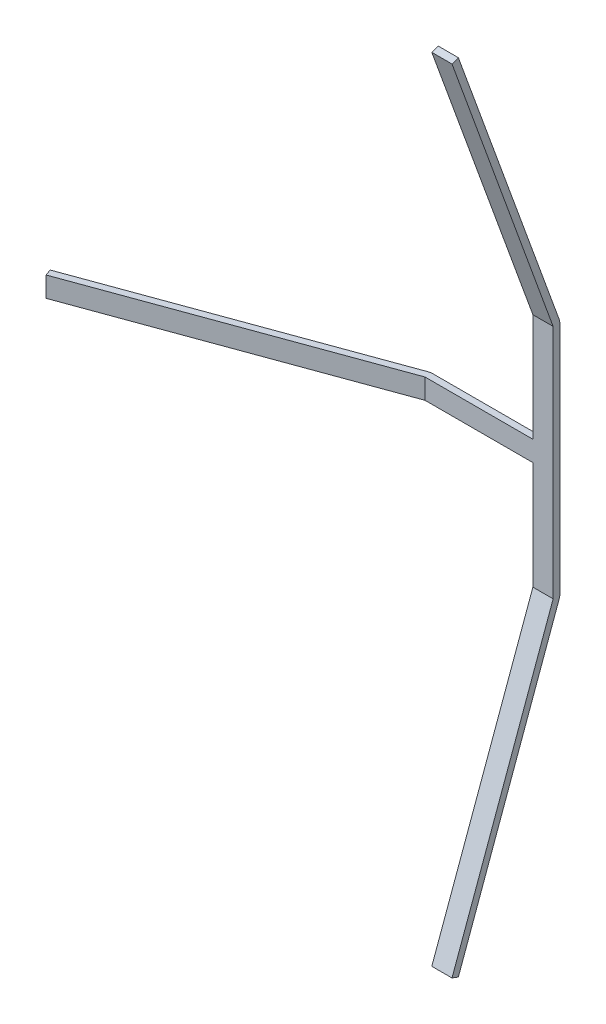
ISO-10303-21;
HEADER;
FILE_DESCRIPTION(('STEP AP214'),'2;1');
FILE_NAME('part.step','',(''),(''),'','','');
FILE_SCHEMA(('AUTOMOTIVE_DESIGN { 1 0 10303 214 1 1 1 1 }'));
ENDSEC;
DATA;
#1=APPLICATION_CONTEXT('core data for automotive mechanical design processes');
#2=APPLICATION_PROTOCOL_DEFINITION('international standard','automotive_design',2000,#1);
#3=PRODUCT_CONTEXT('',#1,'mechanical');
#4=PRODUCT('Part','Part','',(#3));
#5=PRODUCT_RELATED_PRODUCT_CATEGORY('part','',(#4));
#6=PRODUCT_DEFINITION_FORMATION('','',#4);
#7=PRODUCT_DEFINITION_CONTEXT('part definition',#1,'design');
#8=PRODUCT_DEFINITION('design','',#6,#7);
#9=PRODUCT_DEFINITION_SHAPE('','',#8);
#10=(LENGTH_UNIT() NAMED_UNIT(*) SI_UNIT(.MILLI.,.METRE.));
#11=(NAMED_UNIT(*) PLANE_ANGLE_UNIT() SI_UNIT($,.RADIAN.));
#12=(NAMED_UNIT(*) SI_UNIT($,.STERADIAN.) SOLID_ANGLE_UNIT());
#13=UNCERTAINTY_MEASURE_WITH_UNIT(LENGTH_MEASURE(1.E-05),#10,'distance_accuracy_value','');
#14=(GEOMETRIC_REPRESENTATION_CONTEXT(3) GLOBAL_UNCERTAINTY_ASSIGNED_CONTEXT((#13)) GLOBAL_UNIT_ASSIGNED_CONTEXT((#10,
#11,#12)) REPRESENTATION_CONTEXT('',''));
#15=CARTESIAN_POINT('',(0.,0.,0.));
#16=DIRECTION('',(0.,0.,1.));
#17=DIRECTION('',(1.,0.,0.));
#18=AXIS2_PLACEMENT_3D('',#15,#16,#17);
#19=CARTESIAN_POINT('',(-3.42020143325665,160.,-9.3969262078591));
#20=DIRECTION('',(0.93969262078591,0.,-0.342020143325663));
#21=DIRECTION('',(-0.342020143325663,0.,-0.93969262078591));
#22=AXIS2_PLACEMENT_3D('',#19,#20,#21);
#23=PLANE('',#22);
#24=DIRECTION('',(0.,1.,0.));
#25=VECTOR('',#24,1.);
#26=CARTESIAN_POINT('',(0.,160.,0.));
#27=LINE('',#26,#25);
#28=CARTESIAN_POINT('',(0.,160.,0.));
#29=VERTEX_POINT('',#28);
#30=CARTESIAN_POINT('',(0.,190.,0.));
#31=VERTEX_POINT('',#30);
#32=EDGE_CURVE('E102',#29,#31,#27,.T.);
#33=ORIENTED_EDGE('',*,*,#32,.T.);
#34=DIRECTION('',(0.342020143325663,0.,0.93969262078591));
#35=VECTOR('',#34,1.);
#36=CARTESIAN_POINT('',(-3.42020143325665,190.,-9.3969262078591));
#37=LINE('',#36,#35);
#38=CARTESIAN_POINT('',(-3.42020143325665,190.,-9.3969262078591));
#39=VERTEX_POINT('',#38);
#40=EDGE_CURVE('E11',#39,#31,#37,.T.);
#41=ORIENTED_EDGE('',*,*,#40,.F.);
#42=DIRECTION('',(0.,1.,0.));
#43=VECTOR('',#42,1.);
#44=CARTESIAN_POINT('',(-3.42020143325665,160.,-9.3969262078591));
#45=LINE('',#44,#43);
#46=CARTESIAN_POINT('',(-3.42020143325665,160.,-9.3969262078591));
#47=VERTEX_POINT('',#46);
#48=EDGE_CURVE('E89',#47,#39,#45,.T.);
#49=ORIENTED_EDGE('',*,*,#48,.F.);
#50=DIRECTION('',(0.342020143325663,0.,0.93969262078591));
#51=VECTOR('',#50,1.);
#52=CARTESIAN_POINT('',(-3.42020143325665,160.,-9.3969262078591));
#53=LINE('',#52,#51);
#54=EDGE_CURVE('E42',#47,#29,#53,.T.);
#55=ORIENTED_EDGE('',*,*,#54,.T.);
#56=EDGE_LOOP('',(#33,#41,#49,#55));
#57=FACE_BOUND('',#56,.T.);
#58=ADVANCED_FACE('F34',(#57),#23,.F.);
#59=CARTESIAN_POINT('',(-3.42020143325665,190.,-9.3969262078591));
#60=DIRECTION('',(0.,-1.,0.));
#61=DIRECTION('',(1.,0.,0.));
#62=AXIS2_PLACEMENT_3D('',#59,#60,#61);
#63=PLANE('',#62);
#64=DIRECTION('',(0.93969262078591,0.,-0.342020143325663));
#65=VECTOR('',#64,1.);
#66=CARTESIAN_POINT('',(0.,190.,0.));
#67=LINE('',#66,#65);
#68=CARTESIAN_POINT('',(412.121612918201,190.,-150.));
#69=VERTEX_POINT('',#68);
#70=EDGE_CURVE('E62',#31,#69,#67,.T.);
#71=ORIENTED_EDGE('',*,*,#70,.T.);
#72=DIRECTION('',(1.,0.,0.));
#73=VECTOR('',#72,1.);
#74=CARTESIAN_POINT('',(412.121612918201,190.,-150.));
#75=LINE('',#74,#73);
#76=CARTESIAN_POINT('',(572.121612918201,190.,-150.));
#77=VERTEX_POINT('',#76);
#78=EDGE_CURVE('E138',#69,#77,#75,.T.);
#79=ORIENTED_EDGE('',*,*,#78,.T.);
#80=DIRECTION('',(0.,0.,1.));
#81=VECTOR('',#80,1.);
#82=CARTESIAN_POINT('',(572.121612918201,190.,-160.));
#83=LINE('',#82,#81);
#84=CARTESIAN_POINT('',(572.121612918201,190.,-160.));
#85=VERTEX_POINT('',#84);
#86=EDGE_CURVE('E163',#85,#77,#83,.T.);
#87=ORIENTED_EDGE('',*,*,#86,.F.);
#88=DIRECTION('',(1.,0.,0.));
#89=VECTOR('',#88,1.);
#90=CARTESIAN_POINT('',(412.121612918201,190.,-160.));
#91=LINE('',#90,#89);
#92=CARTESIAN_POINT('',(412.121612918201,190.,-160.));
#93=VERTEX_POINT('',#92);
#94=EDGE_CURVE('E100',#93,#85,#91,.T.);
#95=ORIENTED_EDGE('',*,*,#94,.F.);
#96=DIRECTION('',(-0.984807753012209,0.,0.173648177666927));
#97=VECTOR('',#96,1.);
#98=CARTESIAN_POINT('',(412.121612918201,190.,-160.));
#99=LINE('',#98,#97);
#100=CARTESIAN_POINT('',(408.701411484944,190.,-159.396926207859));
#101=VERTEX_POINT('',#100);
#102=EDGE_CURVE('E95',#93,#101,#99,.T.);
#103=ORIENTED_EDGE('',*,*,#102,.T.);
#104=DIRECTION('',(0.93969262078591,0.,-0.342020143325663));
#105=VECTOR('',#104,1.);
#106=CARTESIAN_POINT('',(-3.42020143325665,190.,-9.3969262078591));
#107=LINE('',#106,#105);
#108=EDGE_CURVE('E83',#39,#101,#107,.T.);
#109=ORIENTED_EDGE('',*,*,#108,.F.);
#110=ORIENTED_EDGE('',*,*,#40,.T.);
#111=EDGE_LOOP('',(#71,#79,#87,#95,#103,#109,#110));
#112=FACE_BOUND('',#111,.T.);
#113=ADVANCED_FACE('F96',(#112),#63,.F.);
#114=CARTESIAN_POINT('',(408.701411484944,160.,-159.396926207859));
#115=DIRECTION('',(0.,1.,0.));
#116=DIRECTION('',(-1.,0.,0.));
#117=AXIS2_PLACEMENT_3D('',#114,#115,#116);
#118=PLANE('',#117);
#119=DIRECTION('',(-0.93969262078591,0.,0.342020143325663));
#120=VECTOR('',#119,1.);
#121=CARTESIAN_POINT('',(412.121612918201,160.,-150.));
#122=LINE('',#121,#120);
#123=CARTESIAN_POINT('',(412.121612918201,160.,-150.));
#124=VERTEX_POINT('',#123);
#125=EDGE_CURVE('E119',#124,#29,#122,.T.);
#126=ORIENTED_EDGE('',*,*,#125,.T.);
#127=ORIENTED_EDGE('',*,*,#54,.F.);
#128=DIRECTION('',(-0.93969262078591,0.,0.342020143325663));
#129=VECTOR('',#128,1.);
#130=CARTESIAN_POINT('',(408.701411484944,160.,-159.396926207859));
#131=LINE('',#130,#129);
#132=CARTESIAN_POINT('',(408.701411484944,160.,-159.396926207859));
#133=VERTEX_POINT('',#132);
#134=EDGE_CURVE('E50',#133,#47,#131,.T.);
#135=ORIENTED_EDGE('',*,*,#134,.F.);
#136=DIRECTION('',(0.984807753012209,0.,-0.173648177666927));
#137=VECTOR('',#136,1.);
#138=CARTESIAN_POINT('',(412.121612918201,160.,-160.));
#139=LINE('',#138,#137);
#140=CARTESIAN_POINT('',(412.121612918201,160.,-160.));
#141=VERTEX_POINT('',#140);
#142=EDGE_CURVE('E108',#133,#141,#139,.T.);
#143=ORIENTED_EDGE('',*,*,#142,.T.);
#144=DIRECTION('',(-1.,0.,0.));
#145=VECTOR('',#144,1.);
#146=CARTESIAN_POINT('',(572.121612918201,160.,-160.));
#147=LINE('',#146,#145);
#148=CARTESIAN_POINT('',(572.121612918201,160.,-160.));
#149=VERTEX_POINT('',#148);
#150=EDGE_CURVE('E72',#149,#141,#147,.T.);
#151=ORIENTED_EDGE('',*,*,#150,.F.);
#152=DIRECTION('',(0.,0.,1.));
#153=VECTOR('',#152,1.);
#154=CARTESIAN_POINT('',(572.121612918201,160.,-160.));
#155=LINE('',#154,#153);
#156=CARTESIAN_POINT('',(572.121612918201,160.,-150.));
#157=VERTEX_POINT('',#156);
#158=EDGE_CURVE('E135',#149,#157,#155,.T.);
#159=ORIENTED_EDGE('',*,*,#158,.T.);
#160=DIRECTION('',(-1.,0.,0.));
#161=VECTOR('',#160,1.);
#162=CARTESIAN_POINT('',(572.121612918201,160.,-150.));
#163=LINE('',#162,#161);
#164=EDGE_CURVE('E133',#157,#124,#163,.T.);
#165=ORIENTED_EDGE('',*,*,#164,.T.);
#166=EDGE_LOOP('',(#126,#127,#135,#143,#151,#159,#165));
#167=FACE_BOUND('',#166,.T.);
#168=ADVANCED_FACE('F130',(#167),#118,.F.);
#169=CARTESIAN_POINT('',(-3.42020143325663,0.,-9.3969262078591));
#170=DIRECTION('',(-0.342020143325663,0.,-0.93969262078591));
#171=DIRECTION('',(-0.93969262078591,0.,0.342020143325663));
#172=AXIS2_PLACEMENT_3D('',#169,#170,#171);
#173=PLANE('',#172);
#174=ORIENTED_EDGE('',*,*,#48,.T.);
#175=ORIENTED_EDGE('',*,*,#108,.T.);
#176=DIRECTION('',(0.,-1.,0.));
#177=VECTOR('',#176,1.);
#178=CARTESIAN_POINT('',(408.701411484944,160.,-159.396926207859));
#179=LINE('',#178,#177);
#180=EDGE_CURVE('E87',#101,#133,#179,.T.);
#181=ORIENTED_EDGE('',*,*,#180,.T.);
#182=ORIENTED_EDGE('',*,*,#134,.T.);
#183=EDGE_LOOP('',(#174,#175,#181,#182));
#184=FACE_BOUND('',#183,.T.);
#185=ADVANCED_FACE('F85',(#184),#173,.T.);
#186=CARTESIAN_POINT('',(0.,0.,0.));
#187=DIRECTION('',(-0.342020143325663,0.,-0.93969262078591));
#188=DIRECTION('',(-0.93969262078591,0.,0.342020143325663));
#189=AXIS2_PLACEMENT_3D('',#186,#187,#188);
#190=PLANE('',#189);
#191=ORIENTED_EDGE('',*,*,#32,.F.);
#192=ORIENTED_EDGE('',*,*,#125,.F.);
#193=DIRECTION('',(0.,-1.,0.));
#194=VECTOR('',#193,1.);
#195=CARTESIAN_POINT('',(412.121612918201,160.,-150.));
#196=LINE('',#195,#194);
#197=EDGE_CURVE('E116',#69,#124,#196,.T.);
#198=ORIENTED_EDGE('',*,*,#197,.F.);
#199=ORIENTED_EDGE('',*,*,#70,.F.);
#200=EDGE_LOOP('',(#191,#192,#198,#199));
#201=FACE_BOUND('',#200,.T.);
#202=ADVANCED_FACE('F124',(#201),#190,.F.);
#203=CARTESIAN_POINT('',(412.121612918201,200.568716944079,-160.));
#204=DIRECTION('',(-0.173648177666927,0.,-0.984807753012209));
#205=DIRECTION('',(-0.984807753012209,0.,0.173648177666927));
#206=AXIS2_PLACEMENT_3D('',#203,#204,#205);
#207=PLANE('',#206);
#208=ORIENTED_EDGE('',*,*,#102,.F.);
#209=DIRECTION('',(0.,-1.,0.));
#210=VECTOR('',#209,1.);
#211=CARTESIAN_POINT('',(412.121612918201,200.568716944079,-160.));
#212=LINE('',#211,#210);
#213=EDGE_CURVE('E103',#93,#141,#212,.T.);
#214=ORIENTED_EDGE('',*,*,#213,.T.);
#215=ORIENTED_EDGE('',*,*,#142,.F.);
#216=ORIENTED_EDGE('',*,*,#180,.F.);
#217=EDGE_LOOP('',(#208,#214,#215,#216));
#218=FACE_BOUND('',#217,.T.);
#219=ADVANCED_FACE('F106',(#218),#207,.T.);
#220=CARTESIAN_POINT('',(602.121612918201,-3.42020143325663,-159.396926207859));
#221=DIRECTION('',(-1.,0.,0.));
#222=DIRECTION('',(0.,0.,1.));
#223=AXIS2_PLACEMENT_3D('',#220,#221,#222);
#224=PLANE('',#223);
#225=DIRECTION('',(0.,-0.939692620785911,0.342020143325663));
#226=VECTOR('',#225,1.);
#227=CARTESIAN_POINT('',(602.121612918201,0.,-150.));
#228=LINE('',#227,#226);
#229=CARTESIAN_POINT('',(602.121612918201,0.,-150.));
#230=VERTEX_POINT('',#229);
#231=CARTESIAN_POINT('',(602.121612918201,-412.121612918201,0.));
#232=VERTEX_POINT('',#231);
#233=EDGE_CURVE('E191',#230,#232,#228,.T.);
#234=ORIENTED_EDGE('',*,*,#233,.T.);
#235=DIRECTION('',(0.,0.342020143325663,0.939692620785911));
#236=VECTOR('',#235,1.);
#237=CARTESIAN_POINT('',(602.121612918201,-415.541814351458,-9.39692620785916));
#238=LINE('',#237,#236);
#239=CARTESIAN_POINT('',(602.121612918201,-415.541814351458,-9.39692620785916));
#240=VERTEX_POINT('',#239);
#241=EDGE_CURVE('E201',#240,#232,#238,.T.);
#242=ORIENTED_EDGE('',*,*,#241,.F.);
#243=DIRECTION('',(0.,-0.939692620785911,0.342020143325663));
#244=VECTOR('',#243,1.);
#245=CARTESIAN_POINT('',(602.121612918201,-3.42020143325663,-159.396926207859));
#246=LINE('',#245,#244);
#247=CARTESIAN_POINT('',(602.121612918201,-3.42020143325663,-159.396926207859));
#248=VERTEX_POINT('',#247);
#249=EDGE_CURVE('E180',#248,#240,#246,.T.);
#250=ORIENTED_EDGE('',*,*,#249,.F.);
#251=DIRECTION('',(0.,0.984807753012213,-0.173648177666903));
#252=VECTOR('',#251,1.);
#253=CARTESIAN_POINT('',(602.121612918201,0.,-160.));
#254=LINE('',#253,#252);
#255=CARTESIAN_POINT('',(602.121612918201,0.,-160.));
#256=VERTEX_POINT('',#255);
#257=EDGE_CURVE('E167',#248,#256,#254,.T.);
#258=ORIENTED_EDGE('',*,*,#257,.T.);
#259=DIRECTION('',(0.,-1.,0.));
#260=VECTOR('',#259,1.);
#261=CARTESIAN_POINT('',(602.121612918201,350.,-160.));
#262=LINE('',#261,#260);
#263=CARTESIAN_POINT('',(602.121612918201,350.,-160.));
#264=VERTEX_POINT('',#263);
#265=EDGE_CURVE('E165',#264,#256,#262,.T.);
#266=ORIENTED_EDGE('',*,*,#265,.F.);
#267=DIRECTION('',(0.,0.984807753012209,0.173648177666924));
#268=VECTOR('',#267,1.);
#269=CARTESIAN_POINT('',(602.121612918201,350.,-160.));
#270=LINE('',#269,#268);
#271=CARTESIAN_POINT('',(602.121612918201,353.420201433257,-159.396926207859));
#272=VERTEX_POINT('',#271);
#273=EDGE_CURVE('E232',#264,#272,#270,.T.);
#274=ORIENTED_EDGE('',*,*,#273,.T.);
#275=DIRECTION('',(0.,-0.939692620785911,-0.342020143325663));
#276=VECTOR('',#275,1.);
#277=CARTESIAN_POINT('',(602.121612918201,765.541814351458,-9.39692620785913));
#278=LINE('',#277,#276);
#279=CARTESIAN_POINT('',(602.121612918201,765.541814351458,-9.39692620785913));
#280=VERTEX_POINT('',#279);
#281=EDGE_CURVE('E256',#280,#272,#278,.T.);
#282=ORIENTED_EDGE('',*,*,#281,.F.);
#283=DIRECTION('',(0.,-0.342020143325663,0.93969262078591));
#284=VECTOR('',#283,1.);
#285=CARTESIAN_POINT('',(602.121612918201,765.541814351458,-9.39692620785913));
#286=LINE('',#285,#284);
#287=CARTESIAN_POINT('',(602.121612918201,762.121612918201,0.));
#288=VERTEX_POINT('',#287);
#289=EDGE_CURVE('E237',#280,#288,#286,.T.);
#290=ORIENTED_EDGE('',*,*,#289,.T.);
#291=DIRECTION('',(0.,-0.939692620785911,-0.342020143325663));
#292=VECTOR('',#291,1.);
#293=CARTESIAN_POINT('',(602.121612918201,762.121612918201,0.));
#294=LINE('',#293,#292);
#295=CARTESIAN_POINT('',(602.121612918201,350.,-150.));
#296=VERTEX_POINT('',#295);
#297=EDGE_CURVE('E248',#288,#296,#294,.T.);
#298=ORIENTED_EDGE('',*,*,#297,.T.);
#299=DIRECTION('',(0.,-1.,0.));
#300=VECTOR('',#299,1.);
#301=CARTESIAN_POINT('',(602.121612918201,350.,-150.));
#302=LINE('',#301,#300);
#303=EDGE_CURVE('E159',#296,#230,#302,.T.);
#304=ORIENTED_EDGE('',*,*,#303,.T.);
#305=EDGE_LOOP('',(#234,#242,#250,#258,#266,#274,#282,#290,#298,#304));
#306=FACE_BOUND('',#305,.T.);
#307=ADVANCED_FACE('F278',(#306),#224,.F.);
#308=CARTESIAN_POINT('',(602.121612918201,-415.541814351458,-9.39692620785916));
#309=DIRECTION('',(0.,0.939692620785911,-0.342020143325663));
#310=DIRECTION('',(0.,0.342020143325663,0.939692620785911));
#311=AXIS2_PLACEMENT_3D('',#308,#309,#310);
#312=PLANE('',#311);
#313=DIRECTION('',(-1.,0.,0.));
#314=VECTOR('',#313,1.);
#315=CARTESIAN_POINT('',(602.121612918201,-412.121612918201,0.));
#316=LINE('',#315,#314);
#317=CARTESIAN_POINT('',(572.121612918201,-412.121612918201,0.));
#318=VERTEX_POINT('',#317);
#319=EDGE_CURVE('E194',#232,#318,#316,.T.);
#320=ORIENTED_EDGE('',*,*,#319,.T.);
#321=DIRECTION('',(0.,0.342020143325663,0.939692620785911));
#322=VECTOR('',#321,1.);
#323=CARTESIAN_POINT('',(572.121612918201,-415.541814351458,-9.39692620785916));
#324=LINE('',#323,#322);
#325=CARTESIAN_POINT('',(572.121612918201,-415.541814351458,-9.39692620785916));
#326=VERTEX_POINT('',#325);
#327=EDGE_CURVE('E189',#326,#318,#324,.T.);
#328=ORIENTED_EDGE('',*,*,#327,.F.);
#329=DIRECTION('',(-1.,0.,0.));
#330=VECTOR('',#329,1.);
#331=CARTESIAN_POINT('',(602.121612918201,-415.541814351458,-9.39692620785916));
#332=LINE('',#331,#330);
#333=EDGE_CURVE('E184',#240,#326,#332,.T.);
#334=ORIENTED_EDGE('',*,*,#333,.F.);
#335=ORIENTED_EDGE('',*,*,#241,.T.);
#336=EDGE_LOOP('',(#320,#328,#334,#335));
#337=FACE_BOUND('',#336,.T.);
#338=ADVANCED_FACE('F319',(#337),#312,.F.);
#339=CARTESIAN_POINT('',(572.121612918201,-415.541814351458,-9.39692620785916));
#340=DIRECTION('',(1.,0.,0.));
#341=DIRECTION('',(0.,0.,-1.));
#342=AXIS2_PLACEMENT_3D('',#339,#340,#341);
#343=PLANE('',#342);
#344=DIRECTION('',(0.,0.939692620785911,-0.342020143325663));
#345=VECTOR('',#344,1.);
#346=CARTESIAN_POINT('',(572.121612918201,-412.121612918201,0.));
#347=LINE('',#346,#345);
#348=CARTESIAN_POINT('',(572.121612918201,0.,-150.));
#349=VERTEX_POINT('',#348);
#350=EDGE_CURVE('E181',#318,#349,#347,.T.);
#351=ORIENTED_EDGE('',*,*,#350,.T.);
#352=DIRECTION('',(0.,1.,0.));
#353=VECTOR('',#352,1.);
#354=CARTESIAN_POINT('',(572.121612918201,0.,-150.));
#355=LINE('',#354,#353);
#356=EDGE_CURVE('E139',#349,#157,#355,.T.);
#357=ORIENTED_EDGE('',*,*,#356,.T.);
#358=ORIENTED_EDGE('',*,*,#158,.F.);
#359=DIRECTION('',(0.,1.,0.));
#360=VECTOR('',#359,1.);
#361=CARTESIAN_POINT('',(572.121612918201,0.,-160.));
#362=LINE('',#361,#360);
#363=CARTESIAN_POINT('',(572.121612918201,0.,-160.));
#364=VERTEX_POINT('',#363);
#365=EDGE_CURVE('E162',#364,#149,#362,.T.);
#366=ORIENTED_EDGE('',*,*,#365,.F.);
#367=DIRECTION('',(0.,-0.984807753012213,0.173648177666903));
#368=VECTOR('',#367,1.);
#369=CARTESIAN_POINT('',(572.121612918201,0.,-160.));
#370=LINE('',#369,#368);
#371=CARTESIAN_POINT('',(572.121612918201,-3.42020143325663,-159.396926207859));
#372=VERTEX_POINT('',#371);
#373=EDGE_CURVE('E168',#364,#372,#370,.T.);
#374=ORIENTED_EDGE('',*,*,#373,.T.);
#375=DIRECTION('',(0.,0.939692620785911,-0.342020143325663));
#376=VECTOR('',#375,1.);
#377=CARTESIAN_POINT('',(572.121612918201,-415.541814351458,-9.39692620785916));
#378=LINE('',#377,#376);
#379=EDGE_CURVE('E187',#326,#372,#378,.T.);
#380=ORIENTED_EDGE('',*,*,#379,.F.);
#381=ORIENTED_EDGE('',*,*,#327,.T.);
#382=EDGE_LOOP('',(#351,#357,#358,#366,#374,#380,#381));
#383=FACE_BOUND('',#382,.T.);
#384=ADVANCED_FACE('F324',(#383),#343,.F.);
#385=CARTESIAN_POINT('',(0.,-51.6292721597464,-141.850259441783));
#386=DIRECTION('',(0.,-0.342020143325663,-0.939692620785911));
#387=DIRECTION('',(0.,0.939692620785911,-0.342020143325663));
#388=AXIS2_PLACEMENT_3D('',#385,#386,#387);
#389=PLANE('',#388);
#390=DIRECTION('',(1.,0.,0.));
#391=VECTOR('',#390,1.);
#392=CARTESIAN_POINT('',(602.121612918201,-3.42020143325663,-159.396926207859));
#393=LINE('',#392,#391);
#394=EDGE_CURVE('E177',#372,#248,#393,.T.);
#395=ORIENTED_EDGE('',*,*,#394,.T.);
#396=ORIENTED_EDGE('',*,*,#249,.T.);
#397=ORIENTED_EDGE('',*,*,#333,.T.);
#398=ORIENTED_EDGE('',*,*,#379,.T.);
#399=EDGE_LOOP('',(#395,#396,#397,#398));
#400=FACE_BOUND('',#399,.T.);
#401=ADVANCED_FACE('F365',(#400),#389,.T.);
#402=CARTESIAN_POINT('',(0.,-48.2090707264898,-132.453333233924));
#403=DIRECTION('',(0.,-0.342020143325663,-0.939692620785911));
#404=DIRECTION('',(0.,0.939692620785911,-0.342020143325663));
#405=AXIS2_PLACEMENT_3D('',#402,#403,#404);
#406=PLANE('',#405);
#407=DIRECTION('',(1.,0.,0.));
#408=VECTOR('',#407,1.);
#409=CARTESIAN_POINT('',(602.121612918201,0.,-150.));
#410=LINE('',#409,#408);
#411=EDGE_CURVE('E171',#349,#230,#410,.T.);
#412=ORIENTED_EDGE('',*,*,#411,.F.);
#413=ORIENTED_EDGE('',*,*,#350,.F.);
#414=ORIENTED_EDGE('',*,*,#319,.F.);
#415=ORIENTED_EDGE('',*,*,#233,.F.);
#416=EDGE_LOOP('',(#412,#413,#414,#415));
#417=FACE_BOUND('',#416,.T.);
#418=ADVANCED_FACE('F326',(#417),#406,.F.);
#419=CARTESIAN_POINT('',(561.552895974122,0.,-160.));
#420=DIRECTION('',(0.,-0.173648177666903,-0.984807753012213));
#421=DIRECTION('',(0.,0.984807753012213,-0.173648177666903));
#422=AXIS2_PLACEMENT_3D('',#419,#420,#421);
#423=PLANE('',#422);
#424=ORIENTED_EDGE('',*,*,#373,.F.);
#425=DIRECTION('',(1.,0.,0.));
#426=VECTOR('',#425,1.);
#427=CARTESIAN_POINT('',(561.552895974122,0.,-160.));
#428=LINE('',#427,#426);
#429=EDGE_CURVE('E172',#364,#256,#428,.T.);
#430=ORIENTED_EDGE('',*,*,#429,.T.);
#431=ORIENTED_EDGE('',*,*,#257,.F.);
#432=ORIENTED_EDGE('',*,*,#394,.F.);
#433=EDGE_LOOP('',(#424,#430,#431,#432));
#434=FACE_BOUND('',#433,.T.);
#435=ADVANCED_FACE('F368',(#434),#423,.T.);
#436=CARTESIAN_POINT('',(572.121612918201,190.,-160.));
#437=DIRECTION('',(1.,0.,0.));
#438=DIRECTION('',(0.,0.,-1.));
#439=AXIS2_PLACEMENT_3D('',#436,#437,#438);
#440=PLANE('',#439);
#441=DIRECTION('',(0.,0.939692620785911,0.342020143325663));
#442=VECTOR('',#441,1.);
#443=CARTESIAN_POINT('',(572.121612918201,350.,-150.));
#444=LINE('',#443,#442);
#445=CARTESIAN_POINT('',(572.121612918201,350.,-150.));
#446=VERTEX_POINT('',#445);
#447=CARTESIAN_POINT('',(572.121612918201,762.121612918201,0.));
#448=VERTEX_POINT('',#447);
#449=EDGE_CURVE('E244',#446,#448,#444,.T.);
#450=ORIENTED_EDGE('',*,*,#449,.T.);
#451=DIRECTION('',(0.,-0.342020143325663,0.93969262078591));
#452=VECTOR('',#451,1.);
#453=CARTESIAN_POINT('',(572.121612918201,765.541814351458,-9.39692620785913));
#454=LINE('',#453,#452);
#455=CARTESIAN_POINT('',(572.121612918201,765.541814351458,-9.39692620785913));
#456=VERTEX_POINT('',#455);
#457=EDGE_CURVE('E240',#456,#448,#454,.T.);
#458=ORIENTED_EDGE('',*,*,#457,.F.);
#459=DIRECTION('',(0.,0.939692620785911,0.342020143325663));
#460=VECTOR('',#459,1.);
#461=CARTESIAN_POINT('',(572.121612918201,353.420201433257,-159.396926207859));
#462=LINE('',#461,#460);
#463=CARTESIAN_POINT('',(572.121612918201,353.420201433257,-159.396926207859));
#464=VERTEX_POINT('',#463);
#465=EDGE_CURVE('E243',#464,#456,#462,.T.);
#466=ORIENTED_EDGE('',*,*,#465,.F.);
#467=DIRECTION('',(0.,-0.984807753012209,-0.173648177666924));
#468=VECTOR('',#467,1.);
#469=CARTESIAN_POINT('',(572.121612918201,350.,-160.));
#470=LINE('',#469,#468);
#471=CARTESIAN_POINT('',(572.121612918201,350.,-160.));
#472=VERTEX_POINT('',#471);
#473=EDGE_CURVE('E221',#464,#472,#470,.T.);
#474=ORIENTED_EDGE('',*,*,#473,.T.);
#475=DIRECTION('',(0.,1.,0.));
#476=VECTOR('',#475,1.);
#477=CARTESIAN_POINT('',(572.121612918201,190.,-160.));
#478=LINE('',#477,#476);
#479=EDGE_CURVE('E209',#85,#472,#478,.T.);
#480=ORIENTED_EDGE('',*,*,#479,.F.);
#481=ORIENTED_EDGE('',*,*,#86,.T.);
#482=DIRECTION('',(0.,1.,0.));
#483=VECTOR('',#482,1.);
#484=CARTESIAN_POINT('',(572.121612918201,190.,-150.));
#485=LINE('',#484,#483);
#486=EDGE_CURVE('E149',#77,#446,#485,.T.);
#487=ORIENTED_EDGE('',*,*,#486,.T.);
#488=EDGE_LOOP('',(#450,#458,#466,#474,#480,#481,#487));
#489=FACE_BOUND('',#488,.T.);
#490=ADVANCED_FACE('F328',(#489),#440,.F.);
#491=CARTESIAN_POINT('',(0.,0.,-160.));
#492=DIRECTION('',(0.,0.,-1.));
#493=DIRECTION('',(-1.,0.,0.));
#494=AXIS2_PLACEMENT_3D('',#491,#492,#493);
#495=PLANE('',#494);
#496=ORIENTED_EDGE('',*,*,#429,.F.);
#497=ORIENTED_EDGE('',*,*,#365,.T.);
#498=ORIENTED_EDGE('',*,*,#150,.T.);
#499=ORIENTED_EDGE('',*,*,#213,.F.);
#500=ORIENTED_EDGE('',*,*,#94,.T.);
#501=ORIENTED_EDGE('',*,*,#479,.T.);
#502=DIRECTION('',(1.,0.,0.));
#503=VECTOR('',#502,1.);
#504=CARTESIAN_POINT('',(602.121612918201,350.,-160.));
#505=LINE('',#504,#503);
#506=EDGE_CURVE('E216',#472,#264,#505,.T.);
#507=ORIENTED_EDGE('',*,*,#506,.T.);
#508=ORIENTED_EDGE('',*,*,#265,.T.);
#509=EDGE_LOOP('',(#496,#497,#498,#499,#500,#501,#507,#508));
#510=FACE_BOUND('',#509,.T.);
#511=ADVANCED_FACE('F330',(#510),#495,.T.);
#512=CARTESIAN_POINT('',(0.,0.,-150.));
#513=DIRECTION('',(0.,0.,-1.));
#514=DIRECTION('',(-1.,0.,0.));
#515=AXIS2_PLACEMENT_3D('',#512,#513,#514);
#516=PLANE('',#515);
#517=ORIENTED_EDGE('',*,*,#411,.T.);
#518=ORIENTED_EDGE('',*,*,#303,.F.);
#519=DIRECTION('',(1.,0.,0.));
#520=VECTOR('',#519,1.);
#521=CARTESIAN_POINT('',(602.121612918201,350.,-150.));
#522=LINE('',#521,#520);
#523=EDGE_CURVE('E153',#446,#296,#522,.T.);
#524=ORIENTED_EDGE('',*,*,#523,.F.);
#525=ORIENTED_EDGE('',*,*,#486,.F.);
#526=ORIENTED_EDGE('',*,*,#78,.F.);
#527=ORIENTED_EDGE('',*,*,#197,.T.);
#528=ORIENTED_EDGE('',*,*,#164,.F.);
#529=ORIENTED_EDGE('',*,*,#356,.F.);
#530=EDGE_LOOP('',(#517,#518,#524,#525,#526,#527,#528,#529));
#531=FACE_BOUND('',#530,.T.);
#532=ADVANCED_FACE('F143',(#531),#516,.F.);
#533=CARTESIAN_POINT('',(561.552895974122,350.,-160.));
#534=DIRECTION('',(0.,0.173648177666924,-0.984807753012209));
#535=DIRECTION('',(0.,0.984807753012209,0.173648177666924));
#536=AXIS2_PLACEMENT_3D('',#533,#534,#535);
#537=PLANE('',#536);
#538=ORIENTED_EDGE('',*,*,#473,.F.);
#539=DIRECTION('',(1.,0.,0.));
#540=VECTOR('',#539,1.);
#541=CARTESIAN_POINT('',(561.552895974122,353.420201433257,-159.396926207859));
#542=LINE('',#541,#540);
#543=EDGE_CURVE('E224',#464,#272,#542,.T.);
#544=ORIENTED_EDGE('',*,*,#543,.T.);
#545=ORIENTED_EDGE('',*,*,#273,.F.);
#546=ORIENTED_EDGE('',*,*,#506,.F.);
#547=EDGE_LOOP('',(#538,#544,#545,#546));
#548=FACE_BOUND('',#547,.T.);
#549=ADVANCED_FACE('F335',(#548),#537,.T.);
#550=CARTESIAN_POINT('',(572.121612918201,765.541814351458,-9.39692620785913));
#551=DIRECTION('',(0.,-0.93969262078591,-0.342020143325663));
#552=DIRECTION('',(0.,0.342020143325663,-0.939692620785911));
#553=AXIS2_PLACEMENT_3D('',#550,#551,#552);
#554=PLANE('',#553);
#555=DIRECTION('',(1.,0.,0.));
#556=VECTOR('',#555,1.);
#557=CARTESIAN_POINT('',(572.121612918201,762.121612918201,0.));
#558=LINE('',#557,#556);
#559=EDGE_CURVE('E251',#448,#288,#558,.T.);
#560=ORIENTED_EDGE('',*,*,#559,.T.);
#561=ORIENTED_EDGE('',*,*,#289,.F.);
#562=DIRECTION('',(1.,0.,0.));
#563=VECTOR('',#562,1.);
#564=CARTESIAN_POINT('',(572.121612918201,765.541814351458,-9.39692620785913));
#565=LINE('',#564,#563);
#566=EDGE_CURVE('E247',#456,#280,#565,.T.);
#567=ORIENTED_EDGE('',*,*,#566,.F.);
#568=ORIENTED_EDGE('',*,*,#457,.T.);
#569=EDGE_LOOP('',(#560,#561,#567,#568));
#570=FACE_BOUND('',#569,.T.);
#571=ADVANCED_FACE('F274',(#570),#554,.F.);
#572=CARTESIAN_POINT('',(0.,92.5714946139238,-254.338091136926));
#573=DIRECTION('',(0.,0.342020143325663,-0.939692620785911));
#574=DIRECTION('',(0.,0.939692620785911,0.342020143325663));
#575=AXIS2_PLACEMENT_3D('',#572,#573,#574);
#576=PLANE('',#575);
#577=ORIENTED_EDGE('',*,*,#566,.T.);
#578=ORIENTED_EDGE('',*,*,#281,.T.);
#579=ORIENTED_EDGE('',*,*,#543,.F.);
#580=ORIENTED_EDGE('',*,*,#465,.T.);
#581=EDGE_LOOP('',(#577,#578,#579,#580));
#582=FACE_BOUND('',#581,.T.);
#583=ADVANCED_FACE('F264',(#582),#576,.T.);
#584=CARTESIAN_POINT('',(0.,89.1512931806672,-244.941164929067));
#585=DIRECTION('',(0.,0.342020143325663,-0.939692620785911));
#586=DIRECTION('',(0.,0.939692620785911,0.342020143325663));
#587=AXIS2_PLACEMENT_3D('',#584,#585,#586);
#588=PLANE('',#587);
#589=ORIENTED_EDGE('',*,*,#559,.F.);
#590=ORIENTED_EDGE('',*,*,#449,.F.);
#591=ORIENTED_EDGE('',*,*,#523,.T.);
#592=ORIENTED_EDGE('',*,*,#297,.F.);
#593=EDGE_LOOP('',(#589,#590,#591,#592));
#594=FACE_BOUND('',#593,.T.);
#595=ADVANCED_FACE('F336',(#594),#588,.F.);
#596=CLOSED_SHELL('',(#58,#113,#168,#185,#202,#219,#307,#338,#384,#401,#418,#435,#490,#511,#532,
#549,#571,#583,#595));
#597=MANIFOLD_SOLID_BREP('B2',#596);
#598=ADVANCED_BREP_SHAPE_REPRESENTATION('',(#18,#597),#14);
#599=SHAPE_DEFINITION_REPRESENTATION(#9,#598);
ENDSEC;
END-ISO-10303-21;
